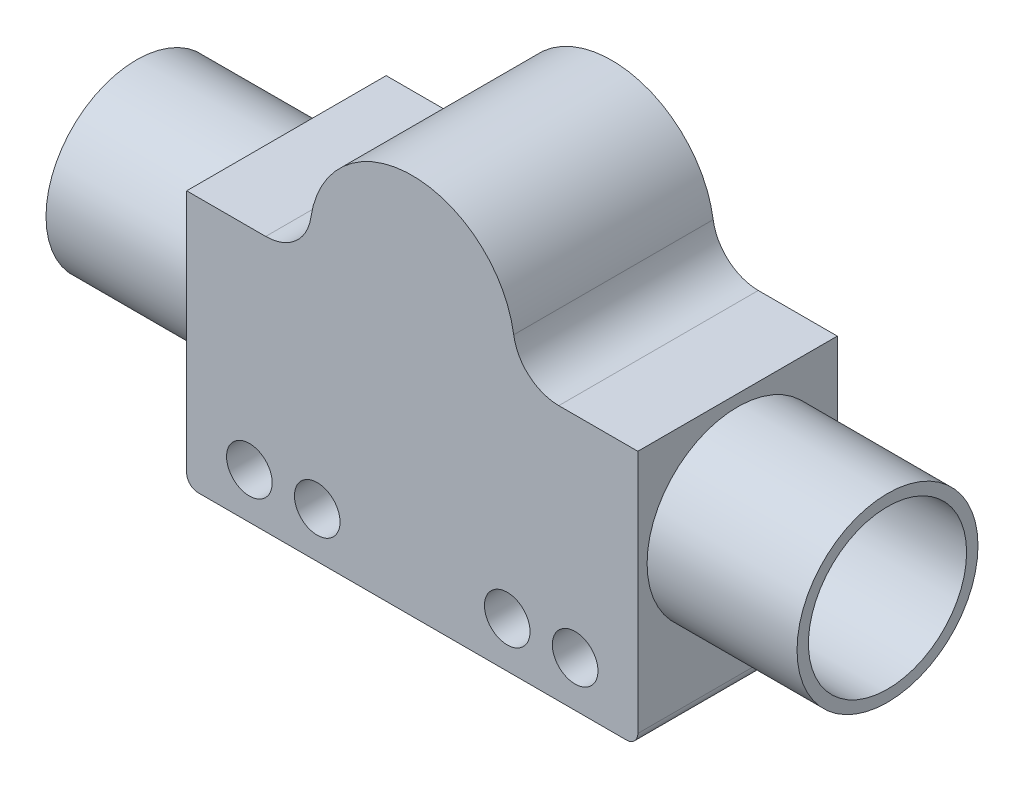
ISO-10303-21;
HEADER;
FILE_DESCRIPTION(('STEP AP214'),'2;1');
FILE_NAME('part.step','',(''),(''),'','','');
FILE_SCHEMA(('AUTOMOTIVE_DESIGN { 1 0 10303 214 1 1 1 1 }'));
ENDSEC;
DATA;
#1=APPLICATION_CONTEXT('core data for automotive mechanical design processes');
#2=APPLICATION_PROTOCOL_DEFINITION('international standard','automotive_design',2000,#1);
#3=PRODUCT_CONTEXT('',#1,'mechanical');
#4=PRODUCT('Part','Part','',(#3));
#5=PRODUCT_RELATED_PRODUCT_CATEGORY('part','',(#4));
#6=PRODUCT_DEFINITION_FORMATION('','',#4);
#7=PRODUCT_DEFINITION_CONTEXT('part definition',#1,'design');
#8=PRODUCT_DEFINITION('design','',#6,#7);
#9=PRODUCT_DEFINITION_SHAPE('','',#8);
#10=(LENGTH_UNIT() NAMED_UNIT(*) SI_UNIT(.MILLI.,.METRE.));
#11=(NAMED_UNIT(*) PLANE_ANGLE_UNIT() SI_UNIT($,.RADIAN.));
#12=(NAMED_UNIT(*) SI_UNIT($,.STERADIAN.) SOLID_ANGLE_UNIT());
#13=UNCERTAINTY_MEASURE_WITH_UNIT(LENGTH_MEASURE(1.E-05),#10,'distance_accuracy_value','');
#14=(GEOMETRIC_REPRESENTATION_CONTEXT(3) GLOBAL_UNCERTAINTY_ASSIGNED_CONTEXT((#13)) GLOBAL_UNIT_ASSIGNED_CONTEXT((#10,
#11,#12)) REPRESENTATION_CONTEXT('',''));
#15=CARTESIAN_POINT('',(0.,0.,0.));
#16=DIRECTION('',(0.,0.,1.));
#17=DIRECTION('',(1.,0.,0.));
#18=AXIS2_PLACEMENT_3D('',#15,#16,#17);
#19=CARTESIAN_POINT('',(-37.575,-27.,-17.5));
#20=DIRECTION('',(0.,0.,-1.));
#21=DIRECTION('',(-1.,0.,0.));
#22=AXIS2_PLACEMENT_3D('',#19,#20,#21);
#23=PLANE('',#22);
#24=CARTESIAN_POINT('',(-28.575,-19.,-17.5));
#25=DIRECTION('',(0.,0.,-1.));
#26=DIRECTION('',(-1.,0.,0.));
#27=AXIS2_PLACEMENT_3D('',#24,#25,#26);
#28=CIRCLE('',#27,4.);
#29=CARTESIAN_POINT('',(-32.575,-19.,-17.5));
#30=VERTEX_POINT('',#29);
#31=EDGE_CURVE('E11',#30,#30,#28,.T.);
#32=ORIENTED_EDGE('',*,*,#31,.F.);
#33=EDGE_LOOP('',(#32));
#34=FACE_BOUND('',#33,.T.);
#35=DIRECTION('',(1.,0.,0.));
#36=VECTOR('',#35,1.);
#37=CARTESIAN_POINT('',(0.,-27.,-17.5));
#38=LINE('',#37,#36);
#39=CARTESIAN_POINT('',(-37.575,-27.,-17.5));
#40=VERTEX_POINT('',#39);
#41=CARTESIAN_POINT('',(37.575,-27.,-17.5));
#42=VERTEX_POINT('',#41);
#43=EDGE_CURVE('E118',#40,#42,#38,.T.);
#44=ORIENTED_EDGE('',*,*,#43,.F.);
#45=CARTESIAN_POINT('',(-37.575,-25.,-17.5));
#46=DIRECTION('',(0.,0.,1.));
#47=DIRECTION('',(1.,0.,0.));
#48=AXIS2_PLACEMENT_3D('',#45,#46,#47);
#49=CIRCLE('',#48,2.);
#50=CARTESIAN_POINT('',(-39.575,-25.,-17.5));
#51=VERTEX_POINT('',#50);
#52=EDGE_CURVE('E114',#40,#51,#49,.F.);
#53=ORIENTED_EDGE('',*,*,#52,.T.);
#54=DIRECTION('',(0.,1.,0.));
#55=VECTOR('',#54,1.);
#56=CARTESIAN_POINT('',(-39.575,0.,-17.5));
#57=LINE('',#56,#55);
#58=CARTESIAN_POINT('',(-39.575,17.875,-17.5));
#59=VERTEX_POINT('',#58);
#60=EDGE_CURVE('E105',#51,#59,#57,.T.);
#61=ORIENTED_EDGE('',*,*,#60,.T.);
#62=DIRECTION('',(1.,0.,0.));
#63=VECTOR('',#62,1.);
#64=CARTESIAN_POINT('',(0.,17.875,-17.5));
#65=LINE('',#64,#63);
#66=CARTESIAN_POINT('',(-25.7096163915372,17.875,-17.5));
#67=VERTEX_POINT('',#66);
#68=EDGE_CURVE('E111',#59,#67,#65,.T.);
#69=ORIENTED_EDGE('',*,*,#68,.T.);
#70=CARTESIAN_POINT('',(-25.7096163915372,25.875,-17.5));
#71=DIRECTION('',(0.,0.,1.));
#72=DIRECTION('',(1.,0.,0.));
#73=AXIS2_PLACEMENT_3D('',#70,#71,#72);
#74=CIRCLE('',#73,8.);
#75=CARTESIAN_POINT('',(-17.7989651941412,24.6826923076923,-17.5));
#76=VERTEX_POINT('',#75);
#77=EDGE_CURVE('E132',#67,#76,#74,.T.);
#78=ORIENTED_EDGE('',*,*,#77,.T.);
#79=CARTESIAN_POINT('',(0.,22.,-17.5));
#80=DIRECTION('',(0.,0.,1.));
#81=DIRECTION('',(1.,0.,0.));
#82=AXIS2_PLACEMENT_3D('',#79,#80,#81);
#83=CIRCLE('',#82,18.);
#84=CARTESIAN_POINT('',(17.7989651941412,24.6826923076923,-17.5));
#85=VERTEX_POINT('',#84);
#86=EDGE_CURVE('E134',#85,#76,#83,.T.);
#87=ORIENTED_EDGE('',*,*,#86,.F.);
#88=CARTESIAN_POINT('',(25.7096163915372,25.875,-17.5));
#89=DIRECTION('',(0.,0.,1.));
#90=DIRECTION('',(1.,0.,0.));
#91=AXIS2_PLACEMENT_3D('',#88,#89,#90);
#92=CIRCLE('',#91,8.);
#93=CARTESIAN_POINT('',(25.7096163915372,17.875,-17.5));
#94=VERTEX_POINT('',#93);
#95=EDGE_CURVE('E91',#94,#85,#92,.F.);
#96=ORIENTED_EDGE('',*,*,#95,.F.);
#97=DIRECTION('',(-1.,0.,0.));
#98=VECTOR('',#97,1.);
#99=CARTESIAN_POINT('',(0.,17.875,-17.5));
#100=LINE('',#99,#98);
#101=CARTESIAN_POINT('',(39.575,17.875,-17.5));
#102=VERTEX_POINT('',#101);
#103=EDGE_CURVE('E282',#102,#94,#100,.T.);
#104=ORIENTED_EDGE('',*,*,#103,.F.);
#105=DIRECTION('',(0.,1.,0.));
#106=VECTOR('',#105,1.);
#107=CARTESIAN_POINT('',(39.575,0.,-17.5));
#108=LINE('',#107,#106);
#109=CARTESIAN_POINT('',(39.575,-25.,-17.5));
#110=VERTEX_POINT('',#109);
#111=EDGE_CURVE('E284',#110,#102,#108,.T.);
#112=ORIENTED_EDGE('',*,*,#111,.F.);
#113=CARTESIAN_POINT('',(37.575,-25.,-17.5));
#114=DIRECTION('',(0.,0.,1.));
#115=DIRECTION('',(1.,0.,0.));
#116=AXIS2_PLACEMENT_3D('',#113,#114,#115);
#117=CIRCLE('',#116,2.);
#118=EDGE_CURVE('E255',#110,#42,#117,.F.);
#119=ORIENTED_EDGE('',*,*,#118,.T.);
#120=EDGE_LOOP('',(#44,#53,#61,#69,#78,#87,#96,#104,#112,#119));
#121=FACE_BOUND('',#120,.T.);
#122=CARTESIAN_POINT('',(28.575,-19.,-17.5));
#123=DIRECTION('',(0.,0.,1.));
#124=DIRECTION('',(1.,0.,0.));
#125=AXIS2_PLACEMENT_3D('',#122,#123,#124);
#126=CIRCLE('',#125,4.00000000000002);
#127=CARTESIAN_POINT('',(32.575,-19.,-17.5));
#128=VERTEX_POINT('',#127);
#129=EDGE_CURVE('E161',#128,#128,#126,.T.);
#130=ORIENTED_EDGE('',*,*,#129,.T.);
#131=EDGE_LOOP('',(#130));
#132=FACE_BOUND('',#131,.T.);
#133=CARTESIAN_POINT('',(16.66875,-19.,-17.5));
#134=DIRECTION('',(0.,0.,1.));
#135=DIRECTION('',(1.,0.,0.));
#136=AXIS2_PLACEMENT_3D('',#133,#134,#135);
#137=CIRCLE('',#136,4.);
#138=CARTESIAN_POINT('',(20.66875,-19.,-17.5));
#139=VERTEX_POINT('',#138);
#140=EDGE_CURVE('E170',#139,#139,#137,.T.);
#141=ORIENTED_EDGE('',*,*,#140,.T.);
#142=EDGE_LOOP('',(#141));
#143=FACE_BOUND('',#142,.T.);
#144=CARTESIAN_POINT('',(-16.66875,-19.,-17.5));
#145=DIRECTION('',(0.,0.,-1.));
#146=DIRECTION('',(-1.,0.,0.));
#147=AXIS2_PLACEMENT_3D('',#144,#145,#146);
#148=CIRCLE('',#147,4.);
#149=CARTESIAN_POINT('',(-20.66875,-19.,-17.5));
#150=VERTEX_POINT('',#149);
#151=EDGE_CURVE('E176',#150,#150,#148,.T.);
#152=ORIENTED_EDGE('',*,*,#151,.F.);
#153=EDGE_LOOP('',(#152));
#154=FACE_BOUND('',#153,.T.);
#155=ADVANCED_FACE('F40',(#34,#121,#132,#143,#154),#23,.T.);
#156=CARTESIAN_POINT('',(0.,0.,17.5));
#157=DIRECTION('',(0.,0.,1.));
#158=DIRECTION('',(1.,0.,0.));
#159=AXIS2_PLACEMENT_3D('',#156,#157,#158);
#160=PLANE('',#159);
#161=CARTESIAN_POINT('',(-16.66875,-19.,17.5));
#162=DIRECTION('',(0.,0.,-1.));
#163=DIRECTION('',(-1.,0.,0.));
#164=AXIS2_PLACEMENT_3D('',#161,#162,#163);
#165=CIRCLE('',#164,4.);
#166=CARTESIAN_POINT('',(-20.66875,-19.,17.5));
#167=VERTEX_POINT('',#166);
#168=EDGE_CURVE('E173',#167,#167,#165,.T.);
#169=ORIENTED_EDGE('',*,*,#168,.T.);
#170=EDGE_LOOP('',(#169));
#171=FACE_BOUND('',#170,.T.);
#172=CARTESIAN_POINT('',(16.66875,-19.,17.5));
#173=DIRECTION('',(0.,0.,1.));
#174=DIRECTION('',(1.,0.,0.));
#175=AXIS2_PLACEMENT_3D('',#172,#173,#174);
#176=CIRCLE('',#175,4.);
#177=CARTESIAN_POINT('',(20.66875,-19.,17.5));
#178=VERTEX_POINT('',#177);
#179=EDGE_CURVE('E167',#178,#178,#176,.T.);
#180=ORIENTED_EDGE('',*,*,#179,.F.);
#181=EDGE_LOOP('',(#180));
#182=FACE_BOUND('',#181,.T.);
#183=CARTESIAN_POINT('',(28.575,-19.,17.5));
#184=DIRECTION('',(0.,0.,1.));
#185=DIRECTION('',(1.,0.,0.));
#186=AXIS2_PLACEMENT_3D('',#183,#184,#185);
#187=CIRCLE('',#186,4.00000000000002);
#188=CARTESIAN_POINT('',(32.575,-19.,17.5));
#189=VERTEX_POINT('',#188);
#190=EDGE_CURVE('E164',#189,#189,#187,.T.);
#191=ORIENTED_EDGE('',*,*,#190,.F.);
#192=EDGE_LOOP('',(#191));
#193=FACE_BOUND('',#192,.T.);
#194=DIRECTION('',(0.,1.,0.));
#195=VECTOR('',#194,1.);
#196=CARTESIAN_POINT('',(-39.575,0.,17.5));
#197=LINE('',#196,#195);
#198=CARTESIAN_POINT('',(-39.575,-25.,17.5));
#199=VERTEX_POINT('',#198);
#200=CARTESIAN_POINT('',(-39.575,17.875,17.5));
#201=VERTEX_POINT('',#200);
#202=EDGE_CURVE('E125',#199,#201,#197,.T.);
#203=ORIENTED_EDGE('',*,*,#202,.F.);
#204=CARTESIAN_POINT('',(-37.575,-25.,17.5));
#205=DIRECTION('',(0.,0.,1.));
#206=DIRECTION('',(1.,0.,0.));
#207=AXIS2_PLACEMENT_3D('',#204,#205,#206);
#208=CIRCLE('',#207,2.);
#209=CARTESIAN_POINT('',(-37.575,-27.,17.5));
#210=VERTEX_POINT('',#209);
#211=EDGE_CURVE('E237',#199,#210,#208,.T.);
#212=ORIENTED_EDGE('',*,*,#211,.T.);
#213=DIRECTION('',(1.,0.,0.));
#214=VECTOR('',#213,1.);
#215=CARTESIAN_POINT('',(0.,-27.,17.5));
#216=LINE('',#215,#214);
#217=CARTESIAN_POINT('',(37.575,-27.,17.5));
#218=VERTEX_POINT('',#217);
#219=EDGE_CURVE('E147',#210,#218,#216,.T.);
#220=ORIENTED_EDGE('',*,*,#219,.T.);
#221=CARTESIAN_POINT('',(37.575,-25.,17.5));
#222=DIRECTION('',(0.,0.,1.));
#223=DIRECTION('',(1.,0.,0.));
#224=AXIS2_PLACEMENT_3D('',#221,#222,#223);
#225=CIRCLE('',#224,2.);
#226=CARTESIAN_POINT('',(39.575,-25.,17.5));
#227=VERTEX_POINT('',#226);
#228=EDGE_CURVE('E245',#218,#227,#225,.T.);
#229=ORIENTED_EDGE('',*,*,#228,.T.);
#230=DIRECTION('',(0.,1.,0.));
#231=VECTOR('',#230,1.);
#232=CARTESIAN_POINT('',(39.575,0.,17.5));
#233=LINE('',#232,#231);
#234=CARTESIAN_POINT('',(39.575,17.875,17.5));
#235=VERTEX_POINT('',#234);
#236=EDGE_CURVE('E145',#227,#235,#233,.T.);
#237=ORIENTED_EDGE('',*,*,#236,.T.);
#238=DIRECTION('',(-1.,0.,0.));
#239=VECTOR('',#238,1.);
#240=CARTESIAN_POINT('',(0.,17.875,17.5));
#241=LINE('',#240,#239);
#242=CARTESIAN_POINT('',(25.7096163915372,17.875,17.5));
#243=VERTEX_POINT('',#242);
#244=EDGE_CURVE('E142',#235,#243,#241,.T.);
#245=ORIENTED_EDGE('',*,*,#244,.T.);
#246=CARTESIAN_POINT('',(25.7096163915372,25.875,17.5));
#247=DIRECTION('',(0.,0.,1.));
#248=DIRECTION('',(1.,0.,0.));
#249=AXIS2_PLACEMENT_3D('',#246,#247,#248);
#250=CIRCLE('',#249,8.);
#251=CARTESIAN_POINT('',(17.7989651941412,24.6826923076923,17.5));
#252=VERTEX_POINT('',#251);
#253=EDGE_CURVE('E140',#243,#252,#250,.F.);
#254=ORIENTED_EDGE('',*,*,#253,.T.);
#255=CARTESIAN_POINT('',(0.,22.,17.5));
#256=DIRECTION('',(0.,0.,1.));
#257=DIRECTION('',(1.,0.,0.));
#258=AXIS2_PLACEMENT_3D('',#255,#256,#257);
#259=CIRCLE('',#258,18.);
#260=CARTESIAN_POINT('',(-17.7989651941412,24.6826923076923,17.5));
#261=VERTEX_POINT('',#260);
#262=EDGE_CURVE('E83',#252,#261,#259,.T.);
#263=ORIENTED_EDGE('',*,*,#262,.T.);
#264=CARTESIAN_POINT('',(-25.7096163915372,25.875,17.5));
#265=DIRECTION('',(0.,0.,1.));
#266=DIRECTION('',(1.,0.,0.));
#267=AXIS2_PLACEMENT_3D('',#264,#265,#266);
#268=CIRCLE('',#267,8.);
#269=CARTESIAN_POINT('',(-25.7096163915372,17.875,17.5));
#270=VERTEX_POINT('',#269);
#271=EDGE_CURVE('E153',#270,#261,#268,.T.);
#272=ORIENTED_EDGE('',*,*,#271,.F.);
#273=DIRECTION('',(1.,0.,0.));
#274=VECTOR('',#273,1.);
#275=CARTESIAN_POINT('',(0.,17.875,17.5));
#276=LINE('',#275,#274);
#277=EDGE_CURVE('E151',#201,#270,#276,.T.);
#278=ORIENTED_EDGE('',*,*,#277,.F.);
#279=EDGE_LOOP('',(#203,#212,#220,#229,#237,#245,#254,#263,#272,#278));
#280=FACE_BOUND('',#279,.T.);
#281=CARTESIAN_POINT('',(-28.575,-19.,17.5));
#282=DIRECTION('',(0.,0.,-1.));
#283=DIRECTION('',(-1.,0.,0.));
#284=AXIS2_PLACEMENT_3D('',#281,#282,#283);
#285=CIRCLE('',#284,4.);
#286=CARTESIAN_POINT('',(-32.575,-19.,17.5));
#287=VERTEX_POINT('',#286);
#288=EDGE_CURVE('E48',#287,#287,#285,.T.);
#289=ORIENTED_EDGE('',*,*,#288,.T.);
#290=EDGE_LOOP('',(#289));
#291=FACE_BOUND('',#290,.T.);
#292=ADVANCED_FACE('F181',(#171,#182,#193,#280,#291),#160,.T.);
#293=CARTESIAN_POINT('',(65.88125,0.,0.));
#294=DIRECTION('',(-1.,0.,0.));
#295=DIRECTION('',(0.,0.,1.));
#296=AXIS2_PLACEMENT_3D('',#293,#294,#295);
#297=CYLINDRICAL_SURFACE('',#296,15.875);
#298=CARTESIAN_POINT('',(-39.575,0.,0.));
#299=DIRECTION('',(-1.,0.,0.));
#300=DIRECTION('',(0.,0.,1.));
#301=AXIS2_PLACEMENT_3D('',#298,#299,#300);
#302=CIRCLE('',#301,15.875);
#303=CARTESIAN_POINT('',(-39.575,0.,15.875));
#304=VERTEX_POINT('',#303);
#305=EDGE_CURVE('E263',#304,#304,#302,.T.);
#306=ORIENTED_EDGE('',*,*,#305,.T.);
#307=EDGE_LOOP('',(#306));
#308=FACE_BOUND('',#307,.T.);
#309=CARTESIAN_POINT('',(-65.88125,0.,0.));
#310=DIRECTION('',(1.,0.,0.));
#311=DIRECTION('',(0.,0.,-1.));
#312=AXIS2_PLACEMENT_3D('',#309,#310,#311);
#313=CIRCLE('',#312,15.875);
#314=CARTESIAN_POINT('',(-65.88125,0.,-15.875));
#315=VERTEX_POINT('',#314);
#316=EDGE_CURVE('E266',#315,#315,#313,.T.);
#317=ORIENTED_EDGE('',*,*,#316,.T.);
#318=EDGE_LOOP('',(#317));
#319=FACE_BOUND('',#318,.T.);
#320=ADVANCED_FACE('F199',(#308,#319),#297,.T.);
#321=CARTESIAN_POINT('',(-65.88125,0.,0.));
#322=DIRECTION('',(1.,0.,0.));
#323=DIRECTION('',(0.,0.,-1.));
#324=AXIS2_PLACEMENT_3D('',#321,#322,#323);
#325=PLANE('',#324);
#326=CARTESIAN_POINT('',(-65.88125,0.,0.));
#327=DIRECTION('',(1.,0.,0.));
#328=DIRECTION('',(0.,0.,-1.));
#329=AXIS2_PLACEMENT_3D('',#326,#327,#328);
#330=CIRCLE('',#329,13.875);
#331=CARTESIAN_POINT('',(-65.88125,0.,-13.875));
#332=VERTEX_POINT('',#331);
#333=EDGE_CURVE('E139',#332,#332,#330,.T.);
#334=ORIENTED_EDGE('',*,*,#333,.T.);
#335=EDGE_LOOP('',(#334));
#336=FACE_BOUND('',#335,.T.);
#337=ORIENTED_EDGE('',*,*,#316,.F.);
#338=EDGE_LOOP('',(#337));
#339=FACE_BOUND('',#338,.T.);
#340=ADVANCED_FACE('F206',(#336,#339),#325,.F.);
#341=CARTESIAN_POINT('',(-39.575,0.,17.5));
#342=DIRECTION('',(-1.,0.,0.));
#343=DIRECTION('',(0.,0.,1.));
#344=AXIS2_PLACEMENT_3D('',#341,#342,#343);
#345=PLANE('',#344);
#346=ORIENTED_EDGE('',*,*,#60,.F.);
#347=DIRECTION('',(0.,0.,-1.));
#348=VECTOR('',#347,1.);
#349=CARTESIAN_POINT('',(-39.575,-25.,17.5));
#350=LINE('',#349,#348);
#351=EDGE_CURVE('E242',#51,#199,#350,.F.);
#352=ORIENTED_EDGE('',*,*,#351,.T.);
#353=ORIENTED_EDGE('',*,*,#202,.T.);
#354=DIRECTION('',(0.,0.,-1.));
#355=VECTOR('',#354,1.);
#356=CARTESIAN_POINT('',(-39.575,17.875,17.5));
#357=LINE('',#356,#355);
#358=EDGE_CURVE('E121',#201,#59,#357,.T.);
#359=ORIENTED_EDGE('',*,*,#358,.T.);
#360=EDGE_LOOP('',(#346,#352,#353,#359));
#361=FACE_BOUND('',#360,.T.);
#362=ORIENTED_EDGE('',*,*,#305,.F.);
#363=EDGE_LOOP('',(#362));
#364=FACE_BOUND('',#363,.T.);
#365=ADVANCED_FACE('F122',(#361,#364),#345,.T.);
#366=CARTESIAN_POINT('',(39.575,0.,17.5));
#367=DIRECTION('',(-1.,0.,0.));
#368=DIRECTION('',(0.,0.,1.));
#369=AXIS2_PLACEMENT_3D('',#366,#367,#368);
#370=PLANE('',#369);
#371=ORIENTED_EDGE('',*,*,#236,.F.);
#372=DIRECTION('',(0.,0.,-1.));
#373=VECTOR('',#372,1.);
#374=CARTESIAN_POINT('',(39.575,-25.,17.5));
#375=LINE('',#374,#373);
#376=EDGE_CURVE('E246',#227,#110,#375,.T.);
#377=ORIENTED_EDGE('',*,*,#376,.T.);
#378=ORIENTED_EDGE('',*,*,#111,.T.);
#379=DIRECTION('',(0.,0.,-1.));
#380=VECTOR('',#379,1.);
#381=CARTESIAN_POINT('',(39.575,17.875,17.5));
#382=LINE('',#381,#380);
#383=EDGE_CURVE('E129',#235,#102,#382,.T.);
#384=ORIENTED_EDGE('',*,*,#383,.F.);
#385=EDGE_LOOP('',(#371,#377,#378,#384));
#386=FACE_BOUND('',#385,.T.);
#387=CARTESIAN_POINT('',(39.575,0.,0.));
#388=DIRECTION('',(-1.,0.,0.));
#389=DIRECTION('',(0.,0.,1.));
#390=AXIS2_PLACEMENT_3D('',#387,#388,#389);
#391=CIRCLE('',#390,15.875);
#392=CARTESIAN_POINT('',(39.575,0.,15.875));
#393=VERTEX_POINT('',#392);
#394=EDGE_CURVE('E262',#393,#393,#391,.T.);
#395=ORIENTED_EDGE('',*,*,#394,.T.);
#396=EDGE_LOOP('',(#395));
#397=FACE_BOUND('',#396,.T.);
#398=ADVANCED_FACE('F301',(#386,#397),#370,.F.);
#399=CARTESIAN_POINT('',(0.,22.,17.5));
#400=DIRECTION('',(0.,0.,-1.));
#401=DIRECTION('',(-1.,0.,0.));
#402=AXIS2_PLACEMENT_3D('',#399,#400,#401);
#403=CYLINDRICAL_SURFACE('',#402,18.);
#404=ORIENTED_EDGE('',*,*,#86,.T.);
#405=DIRECTION('',(0.,0.,-1.));
#406=VECTOR('',#405,1.);
#407=CARTESIAN_POINT('',(-17.7989651941412,24.6826923076923,17.5));
#408=LINE('',#407,#406);
#409=EDGE_CURVE('E56',#261,#76,#408,.T.);
#410=ORIENTED_EDGE('',*,*,#409,.F.);
#411=ORIENTED_EDGE('',*,*,#262,.F.);
#412=DIRECTION('',(0.,0.,-1.));
#413=VECTOR('',#412,1.);
#414=CARTESIAN_POINT('',(17.7989651941412,24.6826923076923,17.5));
#415=LINE('',#414,#413);
#416=EDGE_CURVE('E143',#252,#85,#415,.T.);
#417=ORIENTED_EDGE('',*,*,#416,.T.);
#418=EDGE_LOOP('',(#404,#410,#411,#417));
#419=FACE_BOUND('',#418,.T.);
#420=ADVANCED_FACE('F312',(#419),#403,.T.);
#421=CARTESIAN_POINT('',(-25.7096163915372,25.875,17.5));
#422=DIRECTION('',(0.,0.,-1.));
#423=DIRECTION('',(-1.,0.,0.));
#424=AXIS2_PLACEMENT_3D('',#421,#422,#423);
#425=CYLINDRICAL_SURFACE('',#424,8.);
#426=ORIENTED_EDGE('',*,*,#77,.F.);
#427=DIRECTION('',(0.,0.,-1.));
#428=VECTOR('',#427,1.);
#429=CARTESIAN_POINT('',(-25.7096163915372,17.875,17.5));
#430=LINE('',#429,#428);
#431=EDGE_CURVE('E77',#270,#67,#430,.T.);
#432=ORIENTED_EDGE('',*,*,#431,.F.);
#433=ORIENTED_EDGE('',*,*,#271,.T.);
#434=ORIENTED_EDGE('',*,*,#409,.T.);
#435=EDGE_LOOP('',(#426,#432,#433,#434));
#436=FACE_BOUND('',#435,.T.);
#437=ADVANCED_FACE('F313',(#436),#425,.F.);
#438=CARTESIAN_POINT('',(0.,17.875,17.5));
#439=DIRECTION('',(0.,1.,0.));
#440=DIRECTION('',(-1.,0.,0.));
#441=AXIS2_PLACEMENT_3D('',#438,#439,#440);
#442=PLANE('',#441);
#443=ORIENTED_EDGE('',*,*,#68,.F.);
#444=ORIENTED_EDGE('',*,*,#358,.F.);
#445=ORIENTED_EDGE('',*,*,#277,.T.);
#446=ORIENTED_EDGE('',*,*,#431,.T.);
#447=EDGE_LOOP('',(#443,#444,#445,#446));
#448=FACE_BOUND('',#447,.T.);
#449=ADVANCED_FACE('F131',(#448),#442,.T.);
#450=CARTESIAN_POINT('',(0.,-27.,17.5));
#451=DIRECTION('',(0.,1.,0.));
#452=DIRECTION('',(-1.,0.,0.));
#453=AXIS2_PLACEMENT_3D('',#450,#451,#452);
#454=PLANE('',#453);
#455=ORIENTED_EDGE('',*,*,#219,.F.);
#456=DIRECTION('',(0.,0.,-1.));
#457=VECTOR('',#456,1.);
#458=CARTESIAN_POINT('',(-37.575,-27.,-17.5));
#459=LINE('',#458,#457);
#460=EDGE_CURVE('E244',#210,#40,#459,.T.);
#461=ORIENTED_EDGE('',*,*,#460,.T.);
#462=ORIENTED_EDGE('',*,*,#43,.T.);
#463=DIRECTION('',(0.,0.,-1.));
#464=VECTOR('',#463,1.);
#465=CARTESIAN_POINT('',(37.575,-27.,17.5));
#466=LINE('',#465,#464);
#467=EDGE_CURVE('E259',#42,#218,#466,.F.);
#468=ORIENTED_EDGE('',*,*,#467,.T.);
#469=EDGE_LOOP('',(#455,#461,#462,#468));
#470=FACE_BOUND('',#469,.T.);
#471=ADVANCED_FACE('F289',(#470),#454,.F.);
#472=CARTESIAN_POINT('',(0.,17.875,17.5));
#473=DIRECTION('',(0.,-1.,0.));
#474=DIRECTION('',(1.,0.,0.));
#475=AXIS2_PLACEMENT_3D('',#472,#473,#474);
#476=PLANE('',#475);
#477=ORIENTED_EDGE('',*,*,#103,.T.);
#478=DIRECTION('',(0.,0.,-1.));
#479=VECTOR('',#478,1.);
#480=CARTESIAN_POINT('',(25.7096163915372,17.875,17.5));
#481=LINE('',#480,#479);
#482=EDGE_CURVE('E278',#243,#94,#481,.T.);
#483=ORIENTED_EDGE('',*,*,#482,.F.);
#484=ORIENTED_EDGE('',*,*,#244,.F.);
#485=ORIENTED_EDGE('',*,*,#383,.T.);
#486=EDGE_LOOP('',(#477,#483,#484,#485));
#487=FACE_BOUND('',#486,.T.);
#488=ADVANCED_FACE('F308',(#487),#476,.F.);
#489=CARTESIAN_POINT('',(25.7096163915372,25.875,17.5));
#490=DIRECTION('',(0.,0.,-1.));
#491=DIRECTION('',(-1.,0.,0.));
#492=AXIS2_PLACEMENT_3D('',#489,#490,#491);
#493=CYLINDRICAL_SURFACE('',#492,8.);
#494=ORIENTED_EDGE('',*,*,#95,.T.);
#495=ORIENTED_EDGE('',*,*,#416,.F.);
#496=ORIENTED_EDGE('',*,*,#253,.F.);
#497=ORIENTED_EDGE('',*,*,#482,.T.);
#498=EDGE_LOOP('',(#494,#495,#496,#497));
#499=FACE_BOUND('',#498,.T.);
#500=ADVANCED_FACE('F214',(#499),#493,.F.);
#501=CARTESIAN_POINT('',(65.88125,0.,0.));
#502=DIRECTION('',(1.,0.,0.));
#503=DIRECTION('',(0.,0.,-1.));
#504=AXIS2_PLACEMENT_3D('',#501,#502,#503);
#505=PLANE('',#504);
#506=CARTESIAN_POINT('',(65.88125,0.,0.));
#507=DIRECTION('',(1.,0.,0.));
#508=DIRECTION('',(0.,0.,-1.));
#509=AXIS2_PLACEMENT_3D('',#506,#507,#508);
#510=CIRCLE('',#509,13.875);
#511=CARTESIAN_POINT('',(65.88125,0.,-13.875));
#512=VERTEX_POINT('',#511);
#513=EDGE_CURVE('E158',#512,#512,#510,.T.);
#514=ORIENTED_EDGE('',*,*,#513,.F.);
#515=EDGE_LOOP('',(#514));
#516=FACE_BOUND('',#515,.T.);
#517=CARTESIAN_POINT('',(65.88125,0.,0.));
#518=DIRECTION('',(1.,0.,0.));
#519=DIRECTION('',(0.,0.,-1.));
#520=AXIS2_PLACEMENT_3D('',#517,#518,#519);
#521=CIRCLE('',#520,15.875);
#522=CARTESIAN_POINT('',(65.88125,0.,-15.875));
#523=VERTEX_POINT('',#522);
#524=EDGE_CURVE('E269',#523,#523,#521,.T.);
#525=ORIENTED_EDGE('',*,*,#524,.T.);
#526=EDGE_LOOP('',(#525));
#527=FACE_BOUND('',#526,.T.);
#528=ADVANCED_FACE('F333',(#516,#527),#505,.T.);
#529=ORIENTED_EDGE('',*,*,#524,.F.);
#530=EDGE_LOOP('',(#529));
#531=FACE_BOUND('',#530,.T.);
#532=ORIENTED_EDGE('',*,*,#394,.F.);
#533=EDGE_LOOP('',(#532));
#534=FACE_BOUND('',#533,.T.);
#535=ADVANCED_FACE('F209',(#531,#534),#297,.T.);
#536=CARTESIAN_POINT('',(-65.88125,0.,0.));
#537=DIRECTION('',(1.,0.,0.));
#538=DIRECTION('',(0.,0.,-1.));
#539=AXIS2_PLACEMENT_3D('',#536,#537,#538);
#540=CYLINDRICAL_SURFACE('',#539,13.875);
#541=ORIENTED_EDGE('',*,*,#333,.F.);
#542=EDGE_LOOP('',(#541));
#543=FACE_BOUND('',#542,.T.);
#544=ORIENTED_EDGE('',*,*,#513,.T.);
#545=EDGE_LOOP('',(#544));
#546=FACE_BOUND('',#545,.T.);
#547=ADVANCED_FACE('F216',(#543,#546),#540,.F.);
#548=CARTESIAN_POINT('',(28.575,-19.,-17.5));
#549=DIRECTION('',(0.,0.,1.));
#550=DIRECTION('',(1.,0.,0.));
#551=AXIS2_PLACEMENT_3D('',#548,#549,#550);
#552=CYLINDRICAL_SURFACE('',#551,4.00000000000002);
#553=ORIENTED_EDGE('',*,*,#129,.F.);
#554=EDGE_LOOP('',(#553));
#555=FACE_BOUND('',#554,.T.);
#556=ORIENTED_EDGE('',*,*,#190,.T.);
#557=EDGE_LOOP('',(#556));
#558=FACE_BOUND('',#557,.T.);
#559=ADVANCED_FACE('F219',(#555,#558),#552,.F.);
#560=CARTESIAN_POINT('',(16.66875,-19.,-17.5));
#561=DIRECTION('',(0.,0.,1.));
#562=DIRECTION('',(1.,0.,0.));
#563=AXIS2_PLACEMENT_3D('',#560,#561,#562);
#564=CYLINDRICAL_SURFACE('',#563,4.);
#565=ORIENTED_EDGE('',*,*,#140,.F.);
#566=EDGE_LOOP('',(#565));
#567=FACE_BOUND('',#566,.T.);
#568=ORIENTED_EDGE('',*,*,#179,.T.);
#569=EDGE_LOOP('',(#568));
#570=FACE_BOUND('',#569,.T.);
#571=ADVANCED_FACE('F195',(#567,#570),#564,.F.);
#572=CARTESIAN_POINT('',(-16.66875,-19.,-17.5));
#573=DIRECTION('',(0.,0.,1.));
#574=DIRECTION('',(1.,0.,0.));
#575=AXIS2_PLACEMENT_3D('',#572,#573,#574);
#576=CYLINDRICAL_SURFACE('',#575,4.);
#577=ORIENTED_EDGE('',*,*,#151,.T.);
#578=EDGE_LOOP('',(#577));
#579=FACE_BOUND('',#578,.T.);
#580=ORIENTED_EDGE('',*,*,#168,.F.);
#581=EDGE_LOOP('',(#580));
#582=FACE_BOUND('',#581,.T.);
#583=ADVANCED_FACE('F186',(#579,#582),#576,.F.);
#584=CARTESIAN_POINT('',(-28.575,-19.,-17.5));
#585=DIRECTION('',(0.,0.,1.));
#586=DIRECTION('',(1.,0.,0.));
#587=AXIS2_PLACEMENT_3D('',#584,#585,#586);
#588=CYLINDRICAL_SURFACE('',#587,4.);
#589=ORIENTED_EDGE('',*,*,#31,.T.);
#590=EDGE_LOOP('',(#589));
#591=FACE_BOUND('',#590,.T.);
#592=ORIENTED_EDGE('',*,*,#288,.F.);
#593=EDGE_LOOP('',(#592));
#594=FACE_BOUND('',#593,.T.);
#595=ADVANCED_FACE('F183',(#591,#594),#588,.F.);
#596=CARTESIAN_POINT('',(-37.575,-25.,17.5));
#597=DIRECTION('',(0.,0.,1.));
#598=DIRECTION('',(1.,0.,0.));
#599=AXIS2_PLACEMENT_3D('',#596,#597,#598);
#600=CYLINDRICAL_SURFACE('',#599,2.);
#601=ORIENTED_EDGE('',*,*,#211,.F.);
#602=ORIENTED_EDGE('',*,*,#351,.F.);
#603=ORIENTED_EDGE('',*,*,#52,.F.);
#604=ORIENTED_EDGE('',*,*,#460,.F.);
#605=EDGE_LOOP('',(#601,#602,#603,#604));
#606=FACE_BOUND('',#605,.T.);
#607=ADVANCED_FACE('F185',(#606),#600,.T.);
#608=CARTESIAN_POINT('',(37.575,-25.,17.5));
#609=DIRECTION('',(0.,0.,-1.));
#610=DIRECTION('',(-1.,0.,0.));
#611=AXIS2_PLACEMENT_3D('',#608,#609,#610);
#612=CYLINDRICAL_SURFACE('',#611,2.);
#613=ORIENTED_EDGE('',*,*,#228,.F.);
#614=ORIENTED_EDGE('',*,*,#467,.F.);
#615=ORIENTED_EDGE('',*,*,#118,.F.);
#616=ORIENTED_EDGE('',*,*,#376,.F.);
#617=EDGE_LOOP('',(#613,#614,#615,#616));
#618=FACE_BOUND('',#617,.T.);
#619=ADVANCED_FACE('F192',(#618),#612,.T.);
#620=CLOSED_SHELL('',(#155,#292,#320,#340,#365,#398,#420,#437,#449,#471,#488,#500,#528,#535,
#547,#559,#571,#583,#595,#607,#619));
#621=MANIFOLD_SOLID_BREP('B2',#620);
#622=ADVANCED_BREP_SHAPE_REPRESENTATION('',(#18,#621),#14);
#623=SHAPE_DEFINITION_REPRESENTATION(#9,#622);
ENDSEC;
END-ISO-10303-21;
